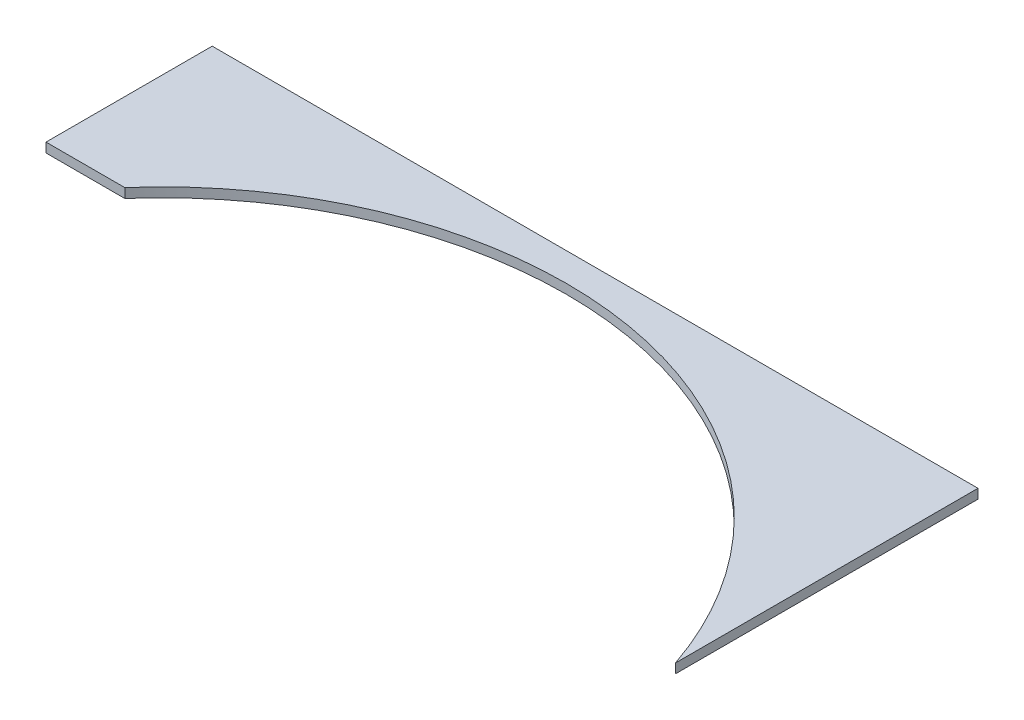
ISO-10303-21;
HEADER;
FILE_DESCRIPTION(('STEP AP214'),'2;1');
FILE_NAME('part.step','',(''),(''),'','','');
FILE_SCHEMA(('AUTOMOTIVE_DESIGN { 1 0 10303 214 1 1 1 1 }'));
ENDSEC;
DATA;
#1=APPLICATION_CONTEXT('core data for automotive mechanical design processes');
#2=APPLICATION_PROTOCOL_DEFINITION('international standard','automotive_design',2000,#1);
#3=PRODUCT_CONTEXT('',#1,'mechanical');
#4=PRODUCT('Part','Part','',(#3));
#5=PRODUCT_RELATED_PRODUCT_CATEGORY('part','',(#4));
#6=PRODUCT_DEFINITION_FORMATION('','',#4);
#7=PRODUCT_DEFINITION_CONTEXT('part definition',#1,'design');
#8=PRODUCT_DEFINITION('design','',#6,#7);
#9=PRODUCT_DEFINITION_SHAPE('','',#8);
#10=(LENGTH_UNIT() NAMED_UNIT(*) SI_UNIT(.MILLI.,.METRE.));
#11=(NAMED_UNIT(*) PLANE_ANGLE_UNIT() SI_UNIT($,.RADIAN.));
#12=(NAMED_UNIT(*) SI_UNIT($,.STERADIAN.) SOLID_ANGLE_UNIT());
#13=UNCERTAINTY_MEASURE_WITH_UNIT(LENGTH_MEASURE(1.E-05),#10,'distance_accuracy_value','');
#14=(GEOMETRIC_REPRESENTATION_CONTEXT(3) GLOBAL_UNCERTAINTY_ASSIGNED_CONTEXT((#13)) GLOBAL_UNIT_ASSIGNED_CONTEXT((#10,
#11,#12)) REPRESENTATION_CONTEXT('',''));
#15=CARTESIAN_POINT('',(0.,0.,0.));
#16=DIRECTION('',(0.,0.,1.));
#17=DIRECTION('',(1.,0.,0.));
#18=AXIS2_PLACEMENT_3D('',#15,#16,#17);
#19=CARTESIAN_POINT('',(0.,6.35,290.704094827586));
#20=DIRECTION('',(0.,-1.,0.));
#21=DIRECTION('',(0.,0.,-1.));
#22=AXIS2_PLACEMENT_3D('',#19,#20,#21);
#23=CYLINDRICAL_SURFACE('',#22,271.654094827586);
#24=DIRECTION('',(0.,1.,0.));
#25=VECTOR('',#24,1.);
#26=CARTESIAN_POINT('',(-204.266839371314,0.,111.6203));
#27=LINE('',#26,#25);
#28=CARTESIAN_POINT('',(-204.266839371314,0.,111.6203));
#29=VERTEX_POINT('',#28);
#30=CARTESIAN_POINT('',(-204.266839371314,6.35,111.6203));
#31=VERTEX_POINT('',#30);
#32=EDGE_CURVE('E95',#29,#31,#27,.T.);
#33=ORIENTED_EDGE('',*,*,#32,.F.);
#34=CARTESIAN_POINT('',(0.,0.,290.704094827586));
#35=DIRECTION('',(0.,1.,0.));
#36=DIRECTION('',(0.,0.,1.));
#37=AXIS2_PLACEMENT_3D('',#34,#35,#36);
#38=CIRCLE('',#37,271.654094827586);
#39=CARTESIAN_POINT('',(257.175,0.,203.2));
#40=VERTEX_POINT('',#39);
#41=EDGE_CURVE('E102',#40,#29,#38,.T.);
#42=ORIENTED_EDGE('',*,*,#41,.F.);
#43=DIRECTION('',(0.,-1.,0.));
#44=VECTOR('',#43,1.);
#45=CARTESIAN_POINT('',(257.175,6.35,203.2));
#46=LINE('',#45,#44);
#47=CARTESIAN_POINT('',(257.175,6.35,203.2));
#48=VERTEX_POINT('',#47);
#49=EDGE_CURVE('E11',#48,#40,#46,.T.);
#50=ORIENTED_EDGE('',*,*,#49,.F.);
#51=CARTESIAN_POINT('',(0.,6.35,290.704094827586));
#52=DIRECTION('',(0.,1.,0.));
#53=DIRECTION('',(0.,0.,1.));
#54=AXIS2_PLACEMENT_3D('',#51,#52,#53);
#55=CIRCLE('',#54,271.654094827586);
#56=EDGE_CURVE('E104',#48,#31,#55,.T.);
#57=ORIENTED_EDGE('',*,*,#56,.T.);
#58=EDGE_LOOP('',(#33,#42,#50,#57));
#59=FACE_BOUND('',#58,.T.);
#60=ADVANCED_FACE('F41',(#59),#23,.F.);
#61=CARTESIAN_POINT('',(257.175,6.35,0.));
#62=DIRECTION('',(1.,0.,0.));
#63=DIRECTION('',(0.,0.,-1.));
#64=AXIS2_PLACEMENT_3D('',#61,#62,#63);
#65=PLANE('',#64);
#66=DIRECTION('',(0.,0.,1.));
#67=VECTOR('',#66,1.);
#68=CARTESIAN_POINT('',(257.175,0.,0.));
#69=LINE('',#68,#67);
#70=CARTESIAN_POINT('',(257.175,0.,0.));
#71=VERTEX_POINT('',#70);
#72=EDGE_CURVE('E110',#71,#40,#69,.T.);
#73=ORIENTED_EDGE('',*,*,#72,.F.);
#74=DIRECTION('',(0.,-1.,0.));
#75=VECTOR('',#74,1.);
#76=CARTESIAN_POINT('',(257.175,6.35,0.));
#77=LINE('',#76,#75);
#78=CARTESIAN_POINT('',(257.175,6.35,0.));
#79=VERTEX_POINT('',#78);
#80=EDGE_CURVE('E49',#79,#71,#77,.T.);
#81=ORIENTED_EDGE('',*,*,#80,.F.);
#82=DIRECTION('',(0.,0.,1.));
#83=VECTOR('',#82,1.);
#84=CARTESIAN_POINT('',(257.175,6.35,0.));
#85=LINE('',#84,#83);
#86=EDGE_CURVE('E142',#79,#48,#85,.T.);
#87=ORIENTED_EDGE('',*,*,#86,.T.);
#88=ORIENTED_EDGE('',*,*,#49,.T.);
#89=EDGE_LOOP('',(#73,#81,#87,#88));
#90=FACE_BOUND('',#89,.T.);
#91=ADVANCED_FACE('F135',(#90),#65,.T.);
#92=CARTESIAN_POINT('',(0.,6.35,0.));
#93=DIRECTION('',(0.,0.,-1.));
#94=DIRECTION('',(-1.,0.,0.));
#95=AXIS2_PLACEMENT_3D('',#92,#93,#94);
#96=PLANE('',#95);
#97=DIRECTION('',(1.,0.,0.));
#98=VECTOR('',#97,1.);
#99=CARTESIAN_POINT('',(0.,0.,0.));
#100=LINE('',#99,#98);
#101=CARTESIAN_POINT('',(-257.175,0.,0.));
#102=VERTEX_POINT('',#101);
#103=EDGE_CURVE('E115',#102,#71,#100,.T.);
#104=ORIENTED_EDGE('',*,*,#103,.F.);
#105=DIRECTION('',(0.,-1.,0.));
#106=VECTOR('',#105,1.);
#107=CARTESIAN_POINT('',(-257.175,6.35,0.));
#108=LINE('',#107,#106);
#109=CARTESIAN_POINT('',(-257.175,6.35,0.));
#110=VERTEX_POINT('',#109);
#111=EDGE_CURVE('E65',#110,#102,#108,.T.);
#112=ORIENTED_EDGE('',*,*,#111,.F.);
#113=DIRECTION('',(1.,0.,0.));
#114=VECTOR('',#113,1.);
#115=CARTESIAN_POINT('',(0.,6.35,0.));
#116=LINE('',#115,#114);
#117=EDGE_CURVE('E131',#110,#79,#116,.T.);
#118=ORIENTED_EDGE('',*,*,#117,.T.);
#119=ORIENTED_EDGE('',*,*,#80,.T.);
#120=EDGE_LOOP('',(#104,#112,#118,#119));
#121=FACE_BOUND('',#120,.T.);
#122=ADVANCED_FACE('F129',(#121),#96,.T.);
#123=CARTESIAN_POINT('',(-257.175,6.35,0.));
#124=DIRECTION('',(1.,0.,0.));
#125=DIRECTION('',(0.,0.,-1.));
#126=AXIS2_PLACEMENT_3D('',#123,#124,#125);
#127=PLANE('',#126);
#128=DIRECTION('',(0.,0.,1.));
#129=VECTOR('',#128,1.);
#130=CARTESIAN_POINT('',(-257.175,0.,0.));
#131=LINE('',#130,#129);
#132=CARTESIAN_POINT('',(-257.175,0.,111.6203));
#133=VERTEX_POINT('',#132);
#134=EDGE_CURVE('E124',#102,#133,#131,.T.);
#135=ORIENTED_EDGE('',*,*,#134,.T.);
#136=DIRECTION('',(0.,1.,0.));
#137=VECTOR('',#136,1.);
#138=CARTESIAN_POINT('',(-257.175,0.,111.6203));
#139=LINE('',#138,#137);
#140=CARTESIAN_POINT('',(-257.175,6.35,111.6203));
#141=VERTEX_POINT('',#140);
#142=EDGE_CURVE('E56',#133,#141,#139,.T.);
#143=ORIENTED_EDGE('',*,*,#142,.T.);
#144=DIRECTION('',(0.,0.,1.));
#145=VECTOR('',#144,1.);
#146=CARTESIAN_POINT('',(-257.175,6.35,0.));
#147=LINE('',#146,#145);
#148=EDGE_CURVE('E119',#110,#141,#147,.T.);
#149=ORIENTED_EDGE('',*,*,#148,.F.);
#150=ORIENTED_EDGE('',*,*,#111,.T.);
#151=EDGE_LOOP('',(#135,#143,#149,#150));
#152=FACE_BOUND('',#151,.T.);
#153=ADVANCED_FACE('F136',(#152),#127,.F.);
#154=CARTESIAN_POINT('',(0.,6.35,0.));
#155=DIRECTION('',(0.,1.,0.));
#156=DIRECTION('',(0.,0.,1.));
#157=AXIS2_PLACEMENT_3D('',#154,#155,#156);
#158=PLANE('',#157);
#159=DIRECTION('',(-1.,0.,0.));
#160=VECTOR('',#159,1.);
#161=CARTESIAN_POINT('',(-257.175,6.35,111.6203));
#162=LINE('',#161,#160);
#163=EDGE_CURVE('E100',#31,#141,#162,.T.);
#164=ORIENTED_EDGE('',*,*,#163,.F.);
#165=ORIENTED_EDGE('',*,*,#56,.F.);
#166=ORIENTED_EDGE('',*,*,#86,.F.);
#167=ORIENTED_EDGE('',*,*,#117,.F.);
#168=ORIENTED_EDGE('',*,*,#148,.T.);
#169=EDGE_LOOP('',(#164,#165,#166,#167,#168));
#170=FACE_BOUND('',#169,.T.);
#171=ADVANCED_FACE('F139',(#170),#158,.T.);
#172=CARTESIAN_POINT('',(0.,0.,0.));
#173=DIRECTION('',(0.,1.,0.));
#174=DIRECTION('',(0.,0.,1.));
#175=AXIS2_PLACEMENT_3D('',#172,#173,#174);
#176=PLANE('',#175);
#177=ORIENTED_EDGE('',*,*,#41,.T.);
#178=DIRECTION('',(-1.,0.,0.));
#179=VECTOR('',#178,1.);
#180=CARTESIAN_POINT('',(-257.175,0.,111.6203));
#181=LINE('',#180,#179);
#182=EDGE_CURVE('E92',#29,#133,#181,.T.);
#183=ORIENTED_EDGE('',*,*,#182,.T.);
#184=ORIENTED_EDGE('',*,*,#134,.F.);
#185=ORIENTED_EDGE('',*,*,#103,.T.);
#186=ORIENTED_EDGE('',*,*,#72,.T.);
#187=EDGE_LOOP('',(#177,#183,#184,#185,#186));
#188=FACE_BOUND('',#187,.T.);
#189=ADVANCED_FACE('F107',(#188),#176,.F.);
#190=CARTESIAN_POINT('',(-257.175,0.,111.6203));
#191=DIRECTION('',(0.,0.,-1.));
#192=DIRECTION('',(-1.,0.,0.));
#193=AXIS2_PLACEMENT_3D('',#190,#191,#192);
#194=PLANE('',#193);
#195=ORIENTED_EDGE('',*,*,#163,.T.);
#196=ORIENTED_EDGE('',*,*,#142,.F.);
#197=ORIENTED_EDGE('',*,*,#182,.F.);
#198=ORIENTED_EDGE('',*,*,#32,.T.);
#199=EDGE_LOOP('',(#195,#196,#197,#198));
#200=FACE_BOUND('',#199,.T.);
#201=ADVANCED_FACE('F94',(#200),#194,.F.);
#202=CLOSED_SHELL('',(#60,#91,#122,#153,#171,#189,#201));
#203=MANIFOLD_SOLID_BREP('B2',#202);
#204=ADVANCED_BREP_SHAPE_REPRESENTATION('',(#18,#203),#14);
#205=SHAPE_DEFINITION_REPRESENTATION(#9,#204);
ENDSEC;
END-ISO-10303-21;
